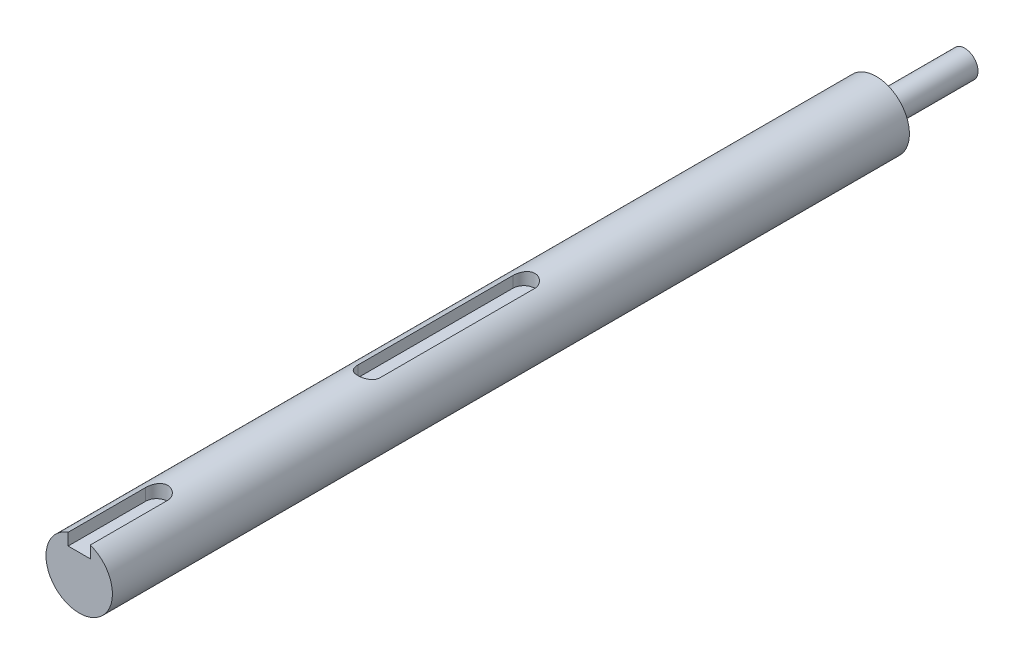
ISO-10303-21;
HEADER;
FILE_DESCRIPTION(('STEP AP214'),'2;1');
FILE_NAME('part.step','',(''),(''),'','','');
FILE_SCHEMA(('AUTOMOTIVE_DESIGN { 1 0 10303 214 1 1 1 1 }'));
ENDSEC;
DATA;
#1=APPLICATION_CONTEXT('core data for automotive mechanical design processes');
#2=APPLICATION_PROTOCOL_DEFINITION('international standard','automotive_design',2000,#1);
#3=PRODUCT_CONTEXT('',#1,'mechanical');
#4=PRODUCT('Part','Part','',(#3));
#5=PRODUCT_RELATED_PRODUCT_CATEGORY('part','',(#4));
#6=PRODUCT_DEFINITION_FORMATION('','',#4);
#7=PRODUCT_DEFINITION_CONTEXT('part definition',#1,'design');
#8=PRODUCT_DEFINITION('design','',#6,#7);
#9=PRODUCT_DEFINITION_SHAPE('','',#8);
#10=(LENGTH_UNIT() NAMED_UNIT(*) SI_UNIT(.MILLI.,.METRE.));
#11=(NAMED_UNIT(*) PLANE_ANGLE_UNIT() SI_UNIT($,.RADIAN.));
#12=(NAMED_UNIT(*) SI_UNIT($,.STERADIAN.) SOLID_ANGLE_UNIT());
#13=UNCERTAINTY_MEASURE_WITH_UNIT(LENGTH_MEASURE(1.E-05),#10,'distance_accuracy_value','');
#14=(GEOMETRIC_REPRESENTATION_CONTEXT(3) GLOBAL_UNCERTAINTY_ASSIGNED_CONTEXT((#13)) GLOBAL_UNIT_ASSIGNED_CONTEXT((#10,
#11,#12)) REPRESENTATION_CONTEXT('',''));
#15=CARTESIAN_POINT('',(0.,0.,0.));
#16=DIRECTION('',(0.,0.,1.));
#17=DIRECTION('',(1.,0.,0.));
#18=AXIS2_PLACEMENT_3D('',#15,#16,#17);
#19=CARTESIAN_POINT('',(0.,0.,200.));
#20=DIRECTION('',(0.,0.,-1.));
#21=DIRECTION('',(-1.,0.,0.));
#22=AXIS2_PLACEMENT_3D('',#19,#20,#21);
#23=CYLINDRICAL_SURFACE('',#22,7.5);
#24=DIRECTION('',(0.,0.,-1.));
#25=VECTOR('',#24,1.);
#26=CARTESIAN_POINT('',(-2.50000000000008,7.07106781186549,200.));
#27=LINE('',#26,#25);
#28=CARTESIAN_POINT('',(-2.50000000000004,7.07106781186548,134.5781));
#29=VERTEX_POINT('',#28);
#30=CARTESIAN_POINT('',(-2.50000000000003,7.07106781186555,99.5780999999999));
#31=VERTEX_POINT('',#30);
#32=EDGE_CURVE('E195',#29,#31,#27,.T.);
#33=ORIENTED_EDGE('',*,*,#32,.T.);
#34=CARTESIAN_POINT('',(-2.50000000000003,7.07106781186555,99.5780999999999));
#35=CARTESIAN_POINT('',(-2.50000899110407,7.07105693273162,99.5098929221796));
#36=CARTESIAN_POINT('',(-2.49720887221585,7.07205443904573,99.4416919253245));
#37=CARTESIAN_POINT('',(-2.48606045780469,7.0759852412101,99.3058189616507));
#38=CARTESIAN_POINT('',(-2.47771365997201,7.07891801450646,99.2381468570119));
#39=CARTESIAN_POINT('',(-2.45557459422795,7.0866270525251,99.1040095116454));
#40=CARTESIAN_POINT('',(-2.44179847763135,7.09139784850121,99.037541297449));
#41=CARTESIAN_POINT('',(-2.40894181030118,7.10262619906006,98.9060917314171));
#42=CARTESIAN_POINT('',(-2.38986106786028,7.10908381460336,98.84111043341));
#43=CARTESIAN_POINT('',(-2.32491551306189,7.13069940793919,98.6491384202853));
#44=CARTESIAN_POINT('',(-2.27131416810246,7.14811243884056,98.5249208425299));
#45=CARTESIAN_POINT('',(-2.14517784106253,7.18697034087522,98.2872231885365));
#46=CARTESIAN_POINT('',(-2.07263123268529,7.20841768551079,98.1737497642197));
#47=CARTESIAN_POINT('',(-1.90762995846815,7.25386182389481,97.9563070965292));
#48=CARTESIAN_POINT('',(-1.81456284630829,7.27792189428069,97.8528148572317));
#49=CARTESIAN_POINT('',(-1.61247071190509,7.32534626726042,97.6625828967662));
#50=CARTESIAN_POINT('',(-1.50344285413656,7.34871044533523,97.5758461586809));
#51=CARTESIAN_POINT('',(-1.26900922493971,7.39284706096347,97.4194017757374));
#52=CARTESIAN_POINT('',(-1.14325025284459,7.41353593532888,97.3501976922577));
#53=CARTESIAN_POINT('',(-0.881073095475295,7.44924021883283,97.2341192175653));
#54=CARTESIAN_POINT('',(-0.744658181225911,7.46425736081216,97.1872380050742));
#55=CARTESIAN_POINT('',(-0.470073371182949,7.48647677762792,97.1187607237417));
#56=CARTESIAN_POINT('',(-0.332129588153775,7.49393272446143,97.0963418290427));
#57=CARTESIAN_POINT('',(-0.0542474216362169,7.5010902103483,97.0748092432614));
#58=CARTESIAN_POINT('',(0.0856904786402043,7.50079359709919,97.0756899990842));
#59=CARTESIAN_POINT('',(0.357759612692393,7.4926509658179,97.1002107104004));
#60=CARTESIAN_POINT('',(0.489981756428158,7.4851015247645,97.1229565956047));
#61=CARTESIAN_POINT('',(0.748610161077317,7.46367401253771,97.1890829959791));
#62=CARTESIAN_POINT('',(0.875016099077767,7.44979559044797,97.2324646553252));
#63=CARTESIAN_POINT('',(1.12038155754036,7.41689170677801,97.3391534241944));
#64=CARTESIAN_POINT('',(1.23922126412501,7.39780094595658,97.4027151128575));
#65=CARTESIAN_POINT('',(1.46481147275363,7.35645969200237,97.5477498784249));
#66=CARTESIAN_POINT('',(1.57155867428941,7.33420833994024,97.629227827602));
#67=CARTESIAN_POINT('',(1.77524334927515,7.2876567985682,97.8122776250068));
#68=CARTESIAN_POINT('',(1.87148402903094,7.26330946699778,97.9146138590281));
#69=CARTESIAN_POINT('',(2.04568006205169,7.21618726182139,98.1342037242863));
#70=CARTESIAN_POINT('',(2.12362950795972,7.1934128978939,98.2514621560069));
#71=CARTESIAN_POINT('',(2.26000831398174,7.15175078440794,98.4998004458842));
#72=CARTESIAN_POINT('',(2.31813252376914,7.13292537370585,98.6310587873325));
#73=CARTESIAN_POINT('',(2.41115057675284,7.10202742655101,98.9022174439745));
#74=CARTESIAN_POINT('',(2.44608109013839,7.08994423522493,99.0421037334303));
#75=CARTESIAN_POINT('',(2.47914539070206,7.07841355236806,99.2491465918699));
#76=CARTESIAN_POINT('',(2.48696265313778,7.07566669236507,99.3147034746355));
#77=CARTESIAN_POINT('',(2.497386540178,7.07199258928497,99.4461951959995));
#78=CARTESIAN_POINT('',(2.49999988848747,7.0710629982382,99.5121294363609));
#79=CARTESIAN_POINT('',(2.50000000000004,7.07106781186556,99.5780999999999));
#80=B_SPLINE_CURVE_WITH_KNOTS('',3,(#34,#35,#36,#37,#38,#39,#40,#41,#42,#43,#44,#45,#46,#47,#48,
#49,#50,#51,#52,#53,#54,#55,#56,#57,#58,#59,#60,#61,#62,#63,#64,#65,#66,#67,#68,#69,#70,#71,#72,
#73,#74,#75,#76,#77,#78,#79),.UNSPECIFIED.,.F.,.F.,(4,2,2,2,2,2,2,2,2,2,2,2,2,2,2,2,2,2,2,2,2,2,
4),(0.,0.204546211838602,0.409037215423678,0.612924429429114,0.816819012805445,1.2240101692326,
1.63145179965524,2.05327864088393,2.47518051341069,2.90809434014448,3.3408757948451,
3.758602785002,4.176230217583,4.57747647846034,4.97874498952317,5.38529148746613,
5.79194868153611,6.21771736826817,6.64362337304799,7.07581676501794,7.50732520398794,
7.70536340013576,7.90314555504337),.UNSPECIFIED.);
#81=CARTESIAN_POINT('',(2.50000000000004,7.07106781186556,99.5780999999999));
#82=VERTEX_POINT('',#81);
#83=EDGE_CURVE('E118',#31,#82,#80,.T.);
#84=ORIENTED_EDGE('',*,*,#83,.T.);
#85=DIRECTION('',(0.,0.,-1.));
#86=VECTOR('',#85,1.);
#87=CARTESIAN_POINT('',(2.50000000000004,7.07106781186557,200.));
#88=LINE('',#87,#86);
#89=CARTESIAN_POINT('',(2.50000000000005,7.07106781186554,134.5781));
#90=VERTEX_POINT('',#89);
#91=EDGE_CURVE('E208',#82,#90,#88,.F.);
#92=ORIENTED_EDGE('',*,*,#91,.T.);
#93=CARTESIAN_POINT('',(2.50000000000005,7.07106781186554,134.5781));
#94=CARTESIAN_POINT('',(2.50000899110407,7.0710569327316,134.64630707782));
#95=CARTESIAN_POINT('',(2.49720887221585,7.07205443904571,134.714508074675));
#96=CARTESIAN_POINT('',(2.4860604578047,7.07598524121008,134.850381038349));
#97=CARTESIAN_POINT('',(2.47771365997202,7.07891801450644,134.918053142988));
#98=CARTESIAN_POINT('',(2.45557459422796,7.08662705252508,135.052190488354));
#99=CARTESIAN_POINT('',(2.44179847763136,7.09139784850119,135.118658702551));
#100=CARTESIAN_POINT('',(2.40894181030122,7.10262619906004,135.250108268583));
#101=CARTESIAN_POINT('',(2.38986106786033,7.10908381460335,135.31508956659));
#102=CARTESIAN_POINT('',(2.32491551306197,7.13069940793918,135.507061579715));
#103=CARTESIAN_POINT('',(2.27131416810251,7.14811243884052,135.63127915747));
#104=CARTESIAN_POINT('',(2.14517784106254,7.18697034087522,135.868976811463));
#105=CARTESIAN_POINT('',(2.07263123268529,7.20841768551086,135.98245023578));
#106=CARTESIAN_POINT('',(1.90762995846817,7.25386182389489,136.199892903471));
#107=CARTESIAN_POINT('',(1.81456284630834,7.27792189428069,136.303385142768));
#108=CARTESIAN_POINT('',(1.61247071190515,7.32534626726038,136.493617103234));
#109=CARTESIAN_POINT('',(1.50344285413659,7.34871044533524,136.580353841319));
#110=CARTESIAN_POINT('',(1.26900922493973,7.3928470609635,136.736798224262));
#111=CARTESIAN_POINT('',(1.14325025284462,7.4135359353289,136.806002307742));
#112=CARTESIAN_POINT('',(0.881073095475307,7.44924021883281,136.922080782435));
#113=CARTESIAN_POINT('',(0.744658181225896,7.46425736081211,136.968961994926));
#114=CARTESIAN_POINT('',(0.470073371182918,7.4864767776279,137.037439276258));
#115=CARTESIAN_POINT('',(0.332129588153756,7.49393272446144,137.059858170957));
#116=CARTESIAN_POINT('',(0.0542474216362145,7.5010902103483,137.081390756739));
#117=CARTESIAN_POINT('',(-0.0856904786402014,7.50079359709914,137.080510000916));
#118=CARTESIAN_POINT('',(-0.357759612692398,7.49265096581785,137.055989289599));
#119=CARTESIAN_POINT('',(-0.489981756428176,7.48510152476451,137.033243404395));
#120=CARTESIAN_POINT('',(-0.748610161077322,7.46367401253772,136.967117004021));
#121=CARTESIAN_POINT('',(-0.875016099077746,7.44979559044792,136.923735344675));
#122=CARTESIAN_POINT('',(-1.12038155754035,7.41689170677795,136.817046575806));
#123=CARTESIAN_POINT('',(-1.23922126412505,7.39780094595658,136.753484887142));
#124=CARTESIAN_POINT('',(-1.46481147275368,7.35645969200239,136.608450121575));
#125=CARTESIAN_POINT('',(-1.57155867428943,7.33420833994023,136.526972172398));
#126=CARTESIAN_POINT('',(-1.77524334927518,7.28765679856819,136.343922374993));
#127=CARTESIAN_POINT('',(-1.871484029031,7.2633094669978,136.241586140972));
#128=CARTESIAN_POINT('',(-2.04568006205176,7.21618726182138,136.021996275714));
#129=CARTESIAN_POINT('',(-2.12362950795978,7.19341289789385,135.904737843993));
#130=CARTESIAN_POINT('',(-2.26000831398178,7.15175078440791,135.656399554116));
#131=CARTESIAN_POINT('',(-2.31813252376917,7.13292537370588,135.525141212667));
#132=CARTESIAN_POINT('',(-2.41115057675285,7.10202742655102,135.253982556025));
#133=CARTESIAN_POINT('',(-2.4460810901384,7.08994423522484,135.11409626657));
#134=CARTESIAN_POINT('',(-2.47914539070207,7.07841355236802,134.90705340813));
#135=CARTESIAN_POINT('',(-2.48696265313779,7.07566669236508,134.841496525364));
#136=CARTESIAN_POINT('',(-2.49738654017801,7.071992589285,134.710004804));
#137=CARTESIAN_POINT('',(-2.49999988848748,7.07106299823822,134.644070563639));
#138=CARTESIAN_POINT('',(-2.50000000000004,7.07106781186548,134.5781));
#139=B_SPLINE_CURVE_WITH_KNOTS('',3,(#93,#94,#95,#96,#97,#98,#99,#100,#101,#102,#103,#104,#105,
#106,#107,#108,#109,#110,#111,#112,#113,#114,#115,#116,#117,#118,#119,#120,#121,#122,#123,#124,
#125,#126,#127,#128,#129,#130,#131,#132,#133,#134,#135,#136,#137,#138),.UNSPECIFIED.,.F.,.F.,(4,
2,2,2,2,2,2,2,2,2,2,2,2,2,2,2,2,2,2,2,2,2,4),(0.,0.204546211838575,0.409037215423636,
0.612924429429028,0.816819012805376,1.22401016923254,1.63145179965524,2.05327864088386,
2.47518051341064,2.90809434014448,3.34087579484513,3.75860278500202,4.17623021758301,
4.57747647846035,4.97874498952318,5.38529148746615,5.7919486815362,6.21771736826825,
6.64362337304805,7.075816765018,7.50732520398798,7.70536340013577,7.90314555504338),.UNSPECIFIED.);
#140=EDGE_CURVE('E199',#90,#29,#139,.T.);
#141=ORIENTED_EDGE('',*,*,#140,.T.);
#142=EDGE_LOOP('',(#33,#84,#92,#141));
#143=FACE_BOUND('',#142,.T.);
#144=CARTESIAN_POINT('',(0.,0.,200.));
#145=DIRECTION('',(0.,0.,1.));
#146=DIRECTION('',(1.,0.,0.));
#147=AXIS2_PLACEMENT_3D('',#144,#145,#146);
#148=CIRCLE('',#147,7.5);
#149=CARTESIAN_POINT('',(-2.50000000000008,7.07106781186549,200.));
#150=VERTEX_POINT('',#149);
#151=CARTESIAN_POINT('',(2.50000000000004,7.07106781186557,200.));
#152=VERTEX_POINT('',#151);
#153=EDGE_CURVE('E132',#150,#152,#148,.T.);
#154=ORIENTED_EDGE('',*,*,#153,.F.);
#155=DIRECTION('',(0.,0.,-1.));
#156=VECTOR('',#155,1.);
#157=CARTESIAN_POINT('',(-2.50000000000008,7.07106781186549,200.));
#158=LINE('',#157,#156);
#159=CARTESIAN_POINT('',(-2.50000000000004,7.07106781186552,182.5));
#160=VERTEX_POINT('',#159);
#161=EDGE_CURVE('E146',#150,#160,#158,.T.);
#162=ORIENTED_EDGE('',*,*,#161,.T.);
#163=CARTESIAN_POINT('',(-2.50000000000004,7.07106781186552,182.5));
#164=CARTESIAN_POINT('',(-2.5000089911041,7.0710569327316,182.43179292218));
#165=CARTESIAN_POINT('',(-2.49720887221589,7.07205443904572,182.363591925324));
#166=CARTESIAN_POINT('',(-2.48606045780475,7.0759852412101,182.227718961651));
#167=CARTESIAN_POINT('',(-2.47771365997206,7.07891801450645,182.160046857012));
#168=CARTESIAN_POINT('',(-2.455574594228,7.08662705252509,182.025909511645));
#169=CARTESIAN_POINT('',(-2.44179847763141,7.0913978485012,181.959441297449));
#170=CARTESIAN_POINT('',(-2.40894181030123,7.10262619906006,181.827991731417));
#171=CARTESIAN_POINT('',(-2.38986106786031,7.10908381460336,181.76301043341));
#172=CARTESIAN_POINT('',(-2.32491551306191,7.13069940793919,181.571038420285));
#173=CARTESIAN_POINT('',(-2.27131416810254,7.14811243884053,181.44682084253));
#174=CARTESIAN_POINT('',(-2.14517784106261,7.18697034087523,181.209123188536));
#175=CARTESIAN_POINT('',(-2.07263123268531,7.20841768551085,181.09564976422));
#176=CARTESIAN_POINT('',(-1.90762995846816,7.25386182389489,180.878207096529));
#177=CARTESIAN_POINT('',(-1.81456284630835,7.27792189428072,180.774714857232));
#178=CARTESIAN_POINT('',(-1.61247071190514,7.32534626726039,180.584482896766));
#179=CARTESIAN_POINT('',(-1.50344285413655,7.34871044533522,180.497746158681));
#180=CARTESIAN_POINT('',(-1.26900922493969,7.39284706096349,180.341301775737));
#181=CARTESIAN_POINT('',(-1.14325025284462,7.41353593532892,180.272097692258));
#182=CARTESIAN_POINT('',(-0.881073095475333,7.44924021883281,180.156019217565));
#183=CARTESIAN_POINT('',(-0.744658181225915,7.46425736081204,180.109138005074));
#184=CARTESIAN_POINT('',(-0.470073371182936,7.48647677762783,180.040660723742));
#185=CARTESIAN_POINT('',(-0.332129588153778,7.49393272446145,180.018241829043));
#186=CARTESIAN_POINT('',(-0.0542474216362329,7.50109021034831,179.996709243261));
#187=CARTESIAN_POINT('',(0.0856904786401912,7.50079359709909,179.997589999084));
#188=CARTESIAN_POINT('',(0.357759612692391,7.49265096581779,180.0221107104));
#189=CARTESIAN_POINT('',(0.489981756428164,7.4851015247645,180.044856595605));
#190=CARTESIAN_POINT('',(0.748610161077305,7.46367401253774,180.110982995979));
#191=CARTESIAN_POINT('',(0.875016099077728,7.4497955904479,180.154364655325));
#192=CARTESIAN_POINT('',(1.12038155754035,7.41689170677793,180.261053424194));
#193=CARTESIAN_POINT('',(1.23922126412505,7.39780094595658,180.324615112857));
#194=CARTESIAN_POINT('',(1.46481147275368,7.35645969200238,180.469649878425));
#195=CARTESIAN_POINT('',(1.57155867428942,7.3342083399402,180.551127827602));
#196=CARTESIAN_POINT('',(1.77524334927514,7.28765679856815,180.734177625007));
#197=CARTESIAN_POINT('',(1.87148402903095,7.26330946699779,180.836513859028));
#198=CARTESIAN_POINT('',(2.04568006205169,7.2161872618214,181.056103724286));
#199=CARTESIAN_POINT('',(2.1236295079597,7.19341289789387,181.173362156007));
#200=CARTESIAN_POINT('',(2.2600083139817,7.15175078440791,181.421700445884));
#201=CARTESIAN_POINT('',(2.31813252376911,7.13292537370586,181.552958787333));
#202=CARTESIAN_POINT('',(2.41115057675283,7.10202742655104,181.824117443975));
#203=CARTESIAN_POINT('',(2.44608109013841,7.08994423522493,181.96400373343));
#204=CARTESIAN_POINT('',(2.47914539070205,7.07841355236807,182.17104659187));
#205=CARTESIAN_POINT('',(2.48696265313775,7.07566669236509,182.236603474635));
#206=CARTESIAN_POINT('',(2.49738654017795,7.071992589285,182.368095195999));
#207=CARTESIAN_POINT('',(2.49999988848742,7.07106299823823,182.434029436361));
#208=CARTESIAN_POINT('',(2.50000000000001,7.07106781186555,182.5));
#209=B_SPLINE_CURVE_WITH_KNOTS('',3,(#163,#164,#165,#166,#167,#168,#169,#170,#171,#172,#173,
#174,#175,#176,#177,#178,#179,#180,#181,#182,#183,#184,#185,#186,#187,#188,#189,#190,#191,#192,
#193,#194,#195,#196,#197,#198,#199,#200,#201,#202,#203,#204,#205,#206,#207,#208),.UNSPECIFIED.,
.F.,.F.,(4,2,2,2,2,2,2,2,2,2,2,2,2,2,2,2,2,2,2,2,2,2,4),(0.,0.204546211838601,0.409037215423662,
0.612924429429112,0.816819012805396,1.22401016923253,1.63145179965524,2.05327864088392,
2.47518051341067,2.90809434014449,3.3408757948451,3.75860278500201,4.17623021758301,
4.57747647846034,4.97874498952316,5.38529148746619,5.79194868153621,6.21771736826818,
6.64362337304797,7.07581676501797,7.50732520398796,7.70536340013571,7.90314555504332),.UNSPECIFIED.);
#210=CARTESIAN_POINT('',(2.50000000000001,7.07106781186555,182.5));
#211=VERTEX_POINT('',#210);
#212=EDGE_CURVE('E11',#160,#211,#209,.T.);
#213=ORIENTED_EDGE('',*,*,#212,.T.);
#214=DIRECTION('',(0.,0.,-1.));
#215=VECTOR('',#214,1.);
#216=CARTESIAN_POINT('',(2.50000000000004,7.07106781186557,200.));
#217=LINE('',#216,#215);
#218=EDGE_CURVE('E143',#211,#152,#217,.F.);
#219=ORIENTED_EDGE('',*,*,#218,.T.);
#220=EDGE_LOOP('',(#154,#162,#213,#219));
#221=FACE_BOUND('',#220,.T.);
#222=CARTESIAN_POINT('',(0.,0.,20.));
#223=DIRECTION('',(0.,0.,-1.));
#224=DIRECTION('',(-1.,0.,0.));
#225=AXIS2_PLACEMENT_3D('',#222,#223,#224);
#226=CIRCLE('',#225,7.5);
#227=CARTESIAN_POINT('',(-7.5,0.,20.));
#228=VERTEX_POINT('',#227);
#229=EDGE_CURVE('E186',#228,#228,#226,.T.);
#230=ORIENTED_EDGE('',*,*,#229,.F.);
#231=EDGE_LOOP('',(#230));
#232=FACE_BOUND('',#231,.T.);
#233=ADVANCED_FACE('F40',(#143,#221,#232),#23,.T.);
#234=CARTESIAN_POINT('',(0.,0.,200.));
#235=DIRECTION('',(0.,0.,1.));
#236=DIRECTION('',(1.,0.,0.));
#237=AXIS2_PLACEMENT_3D('',#234,#235,#236);
#238=PLANE('',#237);
#239=DIRECTION('',(0.,1.,0.));
#240=VECTOR('',#239,1.);
#241=CARTESIAN_POINT('',(-2.50000000000001,4.37106781186563,200.));
#242=LINE('',#241,#240);
#243=CARTESIAN_POINT('',(-2.50000000000001,4.37106781186563,200.));
#244=VERTEX_POINT('',#243);
#245=EDGE_CURVE('E147',#244,#150,#242,.T.);
#246=ORIENTED_EDGE('',*,*,#245,.T.);
#247=ORIENTED_EDGE('',*,*,#153,.T.);
#248=DIRECTION('',(0.,1.,0.));
#249=VECTOR('',#248,1.);
#250=CARTESIAN_POINT('',(2.49999999999994,4.37106781186551,200.));
#251=LINE('',#250,#249);
#252=CARTESIAN_POINT('',(2.49999999999994,4.37106781186551,200.));
#253=VERTEX_POINT('',#252);
#254=EDGE_CURVE('E121',#253,#152,#251,.T.);
#255=ORIENTED_EDGE('',*,*,#254,.F.);
#256=DIRECTION('',(-1.,0.,0.));
#257=VECTOR('',#256,1.);
#258=CARTESIAN_POINT('',(0.,4.37106781186554,200.));
#259=LINE('',#258,#257);
#260=EDGE_CURVE('E54',#253,#244,#259,.T.);
#261=ORIENTED_EDGE('',*,*,#260,.T.);
#262=EDGE_LOOP('',(#246,#247,#255,#261));
#263=FACE_BOUND('',#262,.T.);
#264=ADVANCED_FACE('F130',(#263),#238,.T.);
#265=CARTESIAN_POINT('',(0.,0.,20.));
#266=DIRECTION('',(0.,0.,-1.));
#267=DIRECTION('',(-1.,0.,0.));
#268=AXIS2_PLACEMENT_3D('',#265,#266,#267);
#269=PLANE('',#268);
#270=CARTESIAN_POINT('',(0.,0.,20.));
#271=DIRECTION('',(0.,0.,-1.));
#272=DIRECTION('',(-1.,0.,0.));
#273=AXIS2_PLACEMENT_3D('',#270,#271,#272);
#274=CIRCLE('',#273,3.);
#275=CARTESIAN_POINT('',(-3.,0.,20.));
#276=VERTEX_POINT('',#275);
#277=EDGE_CURVE('E182',#276,#276,#274,.T.);
#278=ORIENTED_EDGE('',*,*,#277,.F.);
#279=EDGE_LOOP('',(#278));
#280=FACE_BOUND('',#279,.T.);
#281=ORIENTED_EDGE('',*,*,#229,.T.);
#282=EDGE_LOOP('',(#281));
#283=FACE_BOUND('',#282,.T.);
#284=ADVANCED_FACE('F259',(#280,#283),#269,.T.);
#285=CARTESIAN_POINT('',(0.,0.,20.));
#286=DIRECTION('',(0.,0.,-1.));
#287=DIRECTION('',(-1.,0.,0.));
#288=AXIS2_PLACEMENT_3D('',#285,#286,#287);
#289=CYLINDRICAL_SURFACE('',#288,3.);
#290=CARTESIAN_POINT('',(0.,0.,0.));
#291=DIRECTION('',(0.,0.,-1.));
#292=DIRECTION('',(-1.,0.,0.));
#293=AXIS2_PLACEMENT_3D('',#290,#291,#292);
#294=CIRCLE('',#293,3.);
#295=CARTESIAN_POINT('',(-3.,0.,0.));
#296=VERTEX_POINT('',#295);
#297=EDGE_CURVE('E171',#296,#296,#294,.T.);
#298=CARTESIAN_POINT('',(-3.,0.,20.));
#299=CARTESIAN_POINT('',(-3.,0.,19.7916666666667));
#300=CARTESIAN_POINT('',(-3.,0.,19.5833333333334));
#301=CARTESIAN_POINT('',(-3.,0.,19.1666666666667));
#302=CARTESIAN_POINT('',(-3.,0.,18.9583333333333));
#303=CARTESIAN_POINT('',(-3.,0.,18.5416666666667));
#304=CARTESIAN_POINT('',(-3.,0.,18.3333333333333));
#305=CARTESIAN_POINT('',(-3.,0.,17.9166666666667));
#306=CARTESIAN_POINT('',(-3.,0.,17.7083333333333));
#307=CARTESIAN_POINT('',(-3.,0.,17.2916666666667));
#308=CARTESIAN_POINT('',(-3.,0.,17.0833333333333));
#309=CARTESIAN_POINT('',(-3.,0.,16.6666666666667));
#310=CARTESIAN_POINT('',(-3.,0.,16.4583333333333));
#311=CARTESIAN_POINT('',(-3.,0.,16.0416666666667));
#312=CARTESIAN_POINT('',(-3.,0.,15.8333333333333));
#313=CARTESIAN_POINT('',(-3.,0.,15.4166666666667));
#314=CARTESIAN_POINT('',(-3.,0.,15.2083333333333));
#315=CARTESIAN_POINT('',(-3.,0.,14.7916666666667));
#316=CARTESIAN_POINT('',(-3.,0.,14.5833333333333));
#317=CARTESIAN_POINT('',(-3.,0.,14.1666666666667));
#318=CARTESIAN_POINT('',(-3.,0.,13.9583333333333));
#319=CARTESIAN_POINT('',(-3.,0.,13.5416666666667));
#320=CARTESIAN_POINT('',(-3.,0.,13.3333333333333));
#321=CARTESIAN_POINT('',(-3.,0.,12.9166666666667));
#322=CARTESIAN_POINT('',(-3.,0.,12.7083333333333));
#323=CARTESIAN_POINT('',(-3.,0.,12.2916666666667));
#324=CARTESIAN_POINT('',(-3.,0.,12.0833333333333));
#325=CARTESIAN_POINT('',(-3.,0.,11.6666666666667));
#326=CARTESIAN_POINT('',(-3.,0.,11.4583333333333));
#327=CARTESIAN_POINT('',(-3.,0.,11.0416666666667));
#328=CARTESIAN_POINT('',(-3.,0.,10.8333333333333));
#329=CARTESIAN_POINT('',(-3.,0.,10.4166666666667));
#330=CARTESIAN_POINT('',(-3.,0.,10.2083333333333));
#331=CARTESIAN_POINT('',(-3.,0.,9.79166666666668));
#332=CARTESIAN_POINT('',(-3.,0.,9.58333333333334));
#333=CARTESIAN_POINT('',(-3.,0.,9.16666666666668));
#334=CARTESIAN_POINT('',(-3.,0.,8.95833333333334));
#335=CARTESIAN_POINT('',(-3.,0.,8.54166666666668));
#336=CARTESIAN_POINT('',(-3.,0.,8.33333333333334));
#337=CARTESIAN_POINT('',(-3.,0.,7.91666666666668));
#338=CARTESIAN_POINT('',(-3.,0.,7.70833333333334));
#339=CARTESIAN_POINT('',(-3.,0.,7.29166666666668));
#340=CARTESIAN_POINT('',(-3.,0.,7.08333333333334));
#341=CARTESIAN_POINT('',(-3.,0.,6.66666666666668));
#342=CARTESIAN_POINT('',(-3.,0.,6.45833333333334));
#343=CARTESIAN_POINT('',(-3.,0.,6.04166666666667));
#344=CARTESIAN_POINT('',(-3.,0.,5.83333333333334));
#345=CARTESIAN_POINT('',(-3.,0.,5.41666666666667));
#346=CARTESIAN_POINT('',(-3.,0.,5.20833333333334));
#347=CARTESIAN_POINT('',(-3.,0.,4.79166666666667));
#348=CARTESIAN_POINT('',(-3.,0.,4.58333333333334));
#349=CARTESIAN_POINT('',(-3.,0.,4.16666666666667));
#350=CARTESIAN_POINT('',(-3.,0.,3.95833333333334));
#351=CARTESIAN_POINT('',(-3.,0.,3.54166666666667));
#352=CARTESIAN_POINT('',(-3.,0.,3.33333333333334));
#353=CARTESIAN_POINT('',(-3.,0.,2.91666666666667));
#354=CARTESIAN_POINT('',(-3.,0.,2.70833333333334));
#355=CARTESIAN_POINT('',(-3.,0.,2.29166666666667));
#356=CARTESIAN_POINT('',(-3.,0.,2.08333333333334));
#357=CARTESIAN_POINT('',(-3.,0.,1.66666666666667));
#358=CARTESIAN_POINT('',(-3.,0.,1.45833333333334));
#359=CARTESIAN_POINT('',(-3.,0.,1.04166666666667));
#360=CARTESIAN_POINT('',(-3.,0.,0.833333333333337));
#361=CARTESIAN_POINT('',(-3.,0.,0.416666666666671));
#362=CARTESIAN_POINT('',(-3.,0.,0.208333333333337));
#363=CARTESIAN_POINT('',(-3.,0.,0.));
#364=B_SPLINE_CURVE_WITH_KNOTS('',3,(#298,#299,#300,#301,#302,#303,#304,#305,#306,#307,#308,
#309,#310,#311,#312,#313,#314,#315,#316,#317,#318,#319,#320,#321,#322,#323,#324,#325,#326,#327,
#328,#329,#330,#331,#332,#333,#334,#335,#336,#337,#338,#339,#340,#341,#342,#343,#344,#345,#346,
#347,#348,#349,#350,#351,#352,#353,#354,#355,#356,#357,#358,#359,#360,#361,#362,#363),
.UNSPECIFIED.,.F.,.F.,(4,2,2,2,2,2,2,2,2,2,2,2,2,2,2,2,2,2,2,2,2,2,2,2,2,2,2,2,2,2,2,2,4),(0.,
0.625000000000004,1.25,1.87500000000001,2.50000000000001,3.125,3.75000000000001,
4.37500000000001,5.00000000000001,5.62500000000001,6.25000000000001,6.87500000000001,
7.50000000000001,8.12500000000001,8.75000000000001,9.37500000000001,10.,10.625,11.25,11.875,
12.5,13.125,13.75,14.375,15.,15.625,16.25,16.875,17.5,18.125,18.75,19.375,20.),.UNSPECIFIED.);
#365=EDGE_CURVE('BSEAM228',#276,#296,#364,.T.);
#366=ORIENTED_EDGE('',*,*,#277,.T.);
#367=ORIENTED_EDGE('',*,*,#297,.F.);
#368=ORIENTED_EDGE('',*,*,#365,.T.);
#369=ORIENTED_EDGE('',*,*,#365,.F.);
#370=EDGE_LOOP('',(#366,#368,#367,#369));
#371=FACE_BOUND('',#370,.T.);
#372=ADVANCED_FACE('F228',(#371),#289,.T.);
#373=CARTESIAN_POINT('',(0.,0.,0.));
#374=DIRECTION('',(0.,0.,1.));
#375=DIRECTION('',(1.,0.,0.));
#376=AXIS2_PLACEMENT_3D('',#373,#374,#375);
#377=PLANE('',#376);
#378=ORIENTED_EDGE('',*,*,#297,.T.);
#379=EDGE_LOOP('',(#378));
#380=FACE_BOUND('',#379,.T.);
#381=ADVANCED_FACE('F226',(#380),#377,.F.);
#382=CARTESIAN_POINT('',(0.,4.57106781186556,99.5780999999999));
#383=DIRECTION('',(0.,1.,0.));
#384=DIRECTION('',(0.,0.,1.));
#385=AXIS2_PLACEMENT_3D('',#382,#383,#384);
#386=CYLINDRICAL_SURFACE('',#385,2.5);
#387=DIRECTION('',(0.,1.,0.));
#388=VECTOR('',#387,1.);
#389=CARTESIAN_POINT('',(-2.49999999999993,4.57106781186554,99.5780999999999));
#390=LINE('',#389,#388);
#391=CARTESIAN_POINT('',(-2.49999999999993,4.57106781186554,99.5780999999999));
#392=VERTEX_POINT('',#391);
#393=EDGE_CURVE('E69',#392,#31,#390,.T.);
#394=ORIENTED_EDGE('',*,*,#393,.F.);
#395=CARTESIAN_POINT('',(0.,4.57106781186556,99.5780999999999));
#396=DIRECTION('',(0.,1.,0.));
#397=DIRECTION('',(0.,0.,1.));
#398=AXIS2_PLACEMENT_3D('',#395,#396,#397);
#399=CIRCLE('',#398,2.5);
#400=CARTESIAN_POINT('',(2.50000000000002,4.57106781186554,99.5781));
#401=VERTEX_POINT('',#400);
#402=EDGE_CURVE('E151',#401,#392,#399,.T.);
#403=ORIENTED_EDGE('',*,*,#402,.F.);
#404=DIRECTION('',(0.,1.,0.));
#405=VECTOR('',#404,1.);
#406=CARTESIAN_POINT('',(2.50000000000002,4.57106781186554,99.5781));
#407=LINE('',#406,#405);
#408=EDGE_CURVE('E167',#401,#82,#407,.T.);
#409=ORIENTED_EDGE('',*,*,#408,.T.);
#410=ORIENTED_EDGE('',*,*,#83,.F.);
#411=EDGE_LOOP('',(#394,#403,#409,#410));
#412=FACE_BOUND('',#411,.T.);
#413=ADVANCED_FACE('F222',(#412),#386,.F.);
#414=CARTESIAN_POINT('',(2.50000000000002,4.57106781186554,99.5781));
#415=DIRECTION('',(1.,0.,0.));
#416=DIRECTION('',(0.,0.,-1.));
#417=AXIS2_PLACEMENT_3D('',#414,#415,#416);
#418=PLANE('',#417);
#419=ORIENTED_EDGE('',*,*,#408,.F.);
#420=DIRECTION('',(0.,0.,-1.));
#421=VECTOR('',#420,1.);
#422=CARTESIAN_POINT('',(2.50000000000002,4.57106781186554,99.5781));
#423=LINE('',#422,#421);
#424=CARTESIAN_POINT('',(2.49999999999999,4.57106781186549,134.5781));
#425=VERTEX_POINT('',#424);
#426=EDGE_CURVE('E163',#425,#401,#423,.T.);
#427=ORIENTED_EDGE('',*,*,#426,.F.);
#428=DIRECTION('',(0.,1.,0.));
#429=VECTOR('',#428,1.);
#430=CARTESIAN_POINT('',(2.49999999999999,4.57106781186549,134.5781));
#431=LINE('',#430,#429);
#432=EDGE_CURVE('E172',#425,#90,#431,.T.);
#433=ORIENTED_EDGE('',*,*,#432,.T.);
#434=ORIENTED_EDGE('',*,*,#91,.F.);
#435=EDGE_LOOP('',(#419,#427,#433,#434));
#436=FACE_BOUND('',#435,.T.);
#437=ADVANCED_FACE('F216',(#436),#418,.F.);
#438=CARTESIAN_POINT('',(0.,4.57106781186555,134.5781));
#439=DIRECTION('',(0.,1.,0.));
#440=DIRECTION('',(0.,0.,1.));
#441=AXIS2_PLACEMENT_3D('',#438,#439,#440);
#442=CYLINDRICAL_SURFACE('',#441,2.5);
#443=ORIENTED_EDGE('',*,*,#432,.F.);
#444=CARTESIAN_POINT('',(0.,4.57106781186555,134.5781));
#445=DIRECTION('',(0.,1.,0.));
#446=DIRECTION('',(0.,0.,1.));
#447=AXIS2_PLACEMENT_3D('',#444,#445,#446);
#448=CIRCLE('',#447,2.5);
#449=CARTESIAN_POINT('',(-2.50000000000003,4.5710678118655,134.5781));
#450=VERTEX_POINT('',#449);
#451=EDGE_CURVE('E159',#450,#425,#448,.T.);
#452=ORIENTED_EDGE('',*,*,#451,.F.);
#453=DIRECTION('',(0.,1.,0.));
#454=VECTOR('',#453,1.);
#455=CARTESIAN_POINT('',(-2.50000000000003,4.5710678118655,134.5781));
#456=LINE('',#455,#454);
#457=EDGE_CURVE('E176',#450,#29,#456,.T.);
#458=ORIENTED_EDGE('',*,*,#457,.T.);
#459=ORIENTED_EDGE('',*,*,#140,.F.);
#460=EDGE_LOOP('',(#443,#452,#458,#459));
#461=FACE_BOUND('',#460,.T.);
#462=ADVANCED_FACE('F210',(#461),#442,.F.);
#463=CARTESIAN_POINT('',(-2.49999999999993,4.57106781186554,99.5780999999999));
#464=DIRECTION('',(-1.,0.,0.));
#465=DIRECTION('',(0.,0.,1.));
#466=AXIS2_PLACEMENT_3D('',#463,#464,#465);
#467=PLANE('',#466);
#468=ORIENTED_EDGE('',*,*,#457,.F.);
#469=DIRECTION('',(0.,0.,1.));
#470=VECTOR('',#469,1.);
#471=CARTESIAN_POINT('',(-2.49999999999993,4.57106781186554,99.5780999999999));
#472=LINE('',#471,#470);
#473=EDGE_CURVE('E155',#392,#450,#472,.T.);
#474=ORIENTED_EDGE('',*,*,#473,.F.);
#475=ORIENTED_EDGE('',*,*,#393,.T.);
#476=ORIENTED_EDGE('',*,*,#32,.F.);
#477=EDGE_LOOP('',(#468,#474,#475,#476));
#478=FACE_BOUND('',#477,.T.);
#479=ADVANCED_FACE('F215',(#478),#467,.F.);
#480=CARTESIAN_POINT('',(0.,4.57106781186556,99.5780999999999));
#481=DIRECTION('',(0.,1.,0.));
#482=DIRECTION('',(0.,0.,1.));
#483=AXIS2_PLACEMENT_3D('',#480,#481,#482);
#484=PLANE('',#483);
#485=ORIENTED_EDGE('',*,*,#402,.T.);
#486=ORIENTED_EDGE('',*,*,#473,.T.);
#487=ORIENTED_EDGE('',*,*,#451,.T.);
#488=ORIENTED_EDGE('',*,*,#426,.T.);
#489=EDGE_LOOP('',(#485,#486,#487,#488));
#490=FACE_BOUND('',#489,.T.);
#491=ADVANCED_FACE('F221',(#490),#484,.T.);
#492=CARTESIAN_POINT('',(0.,4.37106781186553,182.5));
#493=DIRECTION('',(0.,1.,0.));
#494=DIRECTION('',(0.,0.,1.));
#495=AXIS2_PLACEMENT_3D('',#492,#493,#494);
#496=CYLINDRICAL_SURFACE('',#495,2.5);
#497=DIRECTION('',(0.,1.,0.));
#498=VECTOR('',#497,1.);
#499=CARTESIAN_POINT('',(-2.49999999999997,4.37106781186554,182.5));
#500=LINE('',#499,#498);
#501=CARTESIAN_POINT('',(-2.49999999999997,4.37106781186554,182.5));
#502=VERTEX_POINT('',#501);
#503=EDGE_CURVE('E138',#502,#160,#500,.T.);
#504=ORIENTED_EDGE('',*,*,#503,.F.);
#505=CARTESIAN_POINT('',(0.,4.37106781186553,182.5));
#506=DIRECTION('',(0.,1.,0.));
#507=DIRECTION('',(0.,0.,1.));
#508=AXIS2_PLACEMENT_3D('',#505,#506,#507);
#509=CIRCLE('',#508,2.5);
#510=CARTESIAN_POINT('',(2.49999999999992,4.37106781186553,182.5));
#511=VERTEX_POINT('',#510);
#512=EDGE_CURVE('E127',#511,#502,#509,.T.);
#513=ORIENTED_EDGE('',*,*,#512,.F.);
#514=DIRECTION('',(0.,1.,0.));
#515=VECTOR('',#514,1.);
#516=CARTESIAN_POINT('',(2.49999999999992,4.37106781186553,182.5));
#517=LINE('',#516,#515);
#518=EDGE_CURVE('E124',#511,#211,#517,.T.);
#519=ORIENTED_EDGE('',*,*,#518,.T.);
#520=ORIENTED_EDGE('',*,*,#212,.F.);
#521=EDGE_LOOP('',(#504,#513,#519,#520));
#522=FACE_BOUND('',#521,.T.);
#523=ADVANCED_FACE('F248',(#522),#496,.F.);
#524=CARTESIAN_POINT('',(-2.50000000000001,4.37106781186563,200.));
#525=DIRECTION('',(-1.,0.,0.));
#526=DIRECTION('',(0.,0.,1.));
#527=AXIS2_PLACEMENT_3D('',#524,#525,#526);
#528=PLANE('',#527);
#529=ORIENTED_EDGE('',*,*,#245,.F.);
#530=DIRECTION('',(0.,0.,1.));
#531=VECTOR('',#530,1.);
#532=CARTESIAN_POINT('',(-2.50000000000001,4.37106781186563,200.));
#533=LINE('',#532,#531);
#534=EDGE_CURVE('E61',#502,#244,#533,.T.);
#535=ORIENTED_EDGE('',*,*,#534,.F.);
#536=ORIENTED_EDGE('',*,*,#503,.T.);
#537=ORIENTED_EDGE('',*,*,#161,.F.);
#538=EDGE_LOOP('',(#529,#535,#536,#537));
#539=FACE_BOUND('',#538,.T.);
#540=ADVANCED_FACE('F252',(#539),#528,.F.);
#541=CARTESIAN_POINT('',(2.49999999999994,4.37106781186551,200.));
#542=DIRECTION('',(1.,0.,0.));
#543=DIRECTION('',(0.,0.,-1.));
#544=AXIS2_PLACEMENT_3D('',#541,#542,#543);
#545=PLANE('',#544);
#546=ORIENTED_EDGE('',*,*,#518,.F.);
#547=DIRECTION('',(0.,0.,-1.));
#548=VECTOR('',#547,1.);
#549=CARTESIAN_POINT('',(2.49999999999994,4.37106781186551,200.));
#550=LINE('',#549,#548);
#551=EDGE_CURVE('E113',#253,#511,#550,.T.);
#552=ORIENTED_EDGE('',*,*,#551,.F.);
#553=ORIENTED_EDGE('',*,*,#254,.T.);
#554=ORIENTED_EDGE('',*,*,#218,.F.);
#555=EDGE_LOOP('',(#546,#552,#553,#554));
#556=FACE_BOUND('',#555,.T.);
#557=ADVANCED_FACE('F120',(#556),#545,.F.);
#558=CARTESIAN_POINT('',(0.,4.37106781186554,200.));
#559=DIRECTION('',(0.,1.,0.));
#560=DIRECTION('',(0.,0.,1.));
#561=AXIS2_PLACEMENT_3D('',#558,#559,#560);
#562=PLANE('',#561);
#563=ORIENTED_EDGE('',*,*,#551,.T.);
#564=ORIENTED_EDGE('',*,*,#512,.T.);
#565=ORIENTED_EDGE('',*,*,#534,.T.);
#566=ORIENTED_EDGE('',*,*,#260,.F.);
#567=EDGE_LOOP('',(#563,#564,#565,#566));
#568=FACE_BOUND('',#567,.T.);
#569=ADVANCED_FACE('F112',(#568),#562,.T.);
#570=CLOSED_SHELL('',(#233,#264,#284,#372,#381,#413,#437,#462,#479,#491,#523,#540,#557,#569));
#571=MANIFOLD_SOLID_BREP('B2',#570);
#572=ADVANCED_BREP_SHAPE_REPRESENTATION('',(#18,#571),#14);
#573=SHAPE_DEFINITION_REPRESENTATION(#9,#572);
ENDSEC;
END-ISO-10303-21;
